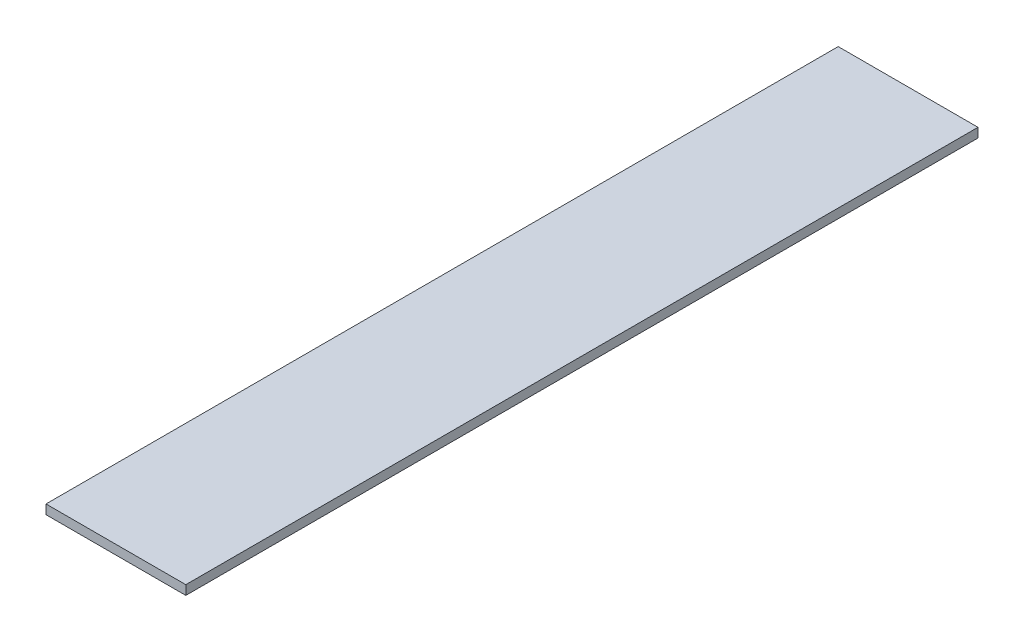
ISO-10303-21;
HEADER;
FILE_DESCRIPTION(('STEP AP214'),'2;1');
FILE_NAME('part.step','',(''),(''),'','','');
FILE_SCHEMA(('AUTOMOTIVE_DESIGN { 1 0 10303 214 1 1 1 1 }'));
ENDSEC;
DATA;
#1=APPLICATION_CONTEXT('core data for automotive mechanical design processes');
#2=APPLICATION_PROTOCOL_DEFINITION('international standard','automotive_design',2000,#1);
#3=PRODUCT_CONTEXT('',#1,'mechanical');
#4=PRODUCT('Part','Part','',(#3));
#5=PRODUCT_RELATED_PRODUCT_CATEGORY('part','',(#4));
#6=PRODUCT_DEFINITION_FORMATION('','',#4);
#7=PRODUCT_DEFINITION_CONTEXT('part definition',#1,'design');
#8=PRODUCT_DEFINITION('design','',#6,#7);
#9=PRODUCT_DEFINITION_SHAPE('','',#8);
#10=(LENGTH_UNIT() NAMED_UNIT(*) SI_UNIT(.MILLI.,.METRE.));
#11=(NAMED_UNIT(*) PLANE_ANGLE_UNIT() SI_UNIT($,.RADIAN.));
#12=(NAMED_UNIT(*) SI_UNIT($,.STERADIAN.) SOLID_ANGLE_UNIT());
#13=UNCERTAINTY_MEASURE_WITH_UNIT(LENGTH_MEASURE(1.E-05),#10,'distance_accuracy_value','');
#14=(GEOMETRIC_REPRESENTATION_CONTEXT(3) GLOBAL_UNCERTAINTY_ASSIGNED_CONTEXT((#13)) GLOBAL_UNIT_ASSIGNED_CONTEXT((#10,
#11,#12)) REPRESENTATION_CONTEXT('',''));
#15=CARTESIAN_POINT('',(0.,0.,0.));
#16=DIRECTION('',(0.,0.,1.));
#17=DIRECTION('',(1.,0.,0.));
#18=AXIS2_PLACEMENT_3D('',#15,#16,#17);
#19=CARTESIAN_POINT('',(0.,1.,0.));
#20=DIRECTION('',(1.,0.,0.));
#21=DIRECTION('',(0.,0.,-1.));
#22=AXIS2_PLACEMENT_3D('',#19,#20,#21);
#23=PLANE('',#22);
#24=DIRECTION('',(0.,0.,1.));
#25=VECTOR('',#24,1.);
#26=CARTESIAN_POINT('',(0.,0.,0.));
#27=LINE('',#26,#25);
#28=CARTESIAN_POINT('',(0.,0.,-85.));
#29=VERTEX_POINT('',#28);
#30=CARTESIAN_POINT('',(0.,0.,0.));
#31=VERTEX_POINT('',#30);
#32=EDGE_CURVE('E96',#29,#31,#27,.T.);
#33=ORIENTED_EDGE('',*,*,#32,.T.);
#34=DIRECTION('',(0.,-1.,0.));
#35=VECTOR('',#34,1.);
#36=CARTESIAN_POINT('',(0.,1.,0.));
#37=LINE('',#36,#35);
#38=CARTESIAN_POINT('',(0.,1.,0.));
#39=VERTEX_POINT('',#38);
#40=EDGE_CURVE('E11',#39,#31,#37,.T.);
#41=ORIENTED_EDGE('',*,*,#40,.F.);
#42=DIRECTION('',(0.,0.,1.));
#43=VECTOR('',#42,1.);
#44=CARTESIAN_POINT('',(0.,1.,0.));
#45=LINE('',#44,#43);
#46=CARTESIAN_POINT('',(0.,1.,-85.));
#47=VERTEX_POINT('',#46);
#48=EDGE_CURVE('E84',#47,#39,#45,.T.);
#49=ORIENTED_EDGE('',*,*,#48,.F.);
#50=DIRECTION('',(0.,-1.,0.));
#51=VECTOR('',#50,1.);
#52=CARTESIAN_POINT('',(0.,1.,-85.));
#53=LINE('',#52,#51);
#54=EDGE_CURVE('E92',#47,#29,#53,.T.);
#55=ORIENTED_EDGE('',*,*,#54,.T.);
#56=EDGE_LOOP('',(#33,#41,#49,#55));
#57=FACE_BOUND('',#56,.T.);
#58=ADVANCED_FACE('F33',(#57),#23,.F.);
#59=CARTESIAN_POINT('',(0.,1.,0.));
#60=DIRECTION('',(0.,0.,-1.));
#61=DIRECTION('',(-1.,0.,0.));
#62=AXIS2_PLACEMENT_3D('',#59,#60,#61);
#63=PLANE('',#62);
#64=DIRECTION('',(1.,0.,0.));
#65=VECTOR('',#64,1.);
#66=CARTESIAN_POINT('',(0.,0.,0.));
#67=LINE('',#66,#65);
#68=CARTESIAN_POINT('',(15.,0.,0.));
#69=VERTEX_POINT('',#68);
#70=EDGE_CURVE('E88',#31,#69,#67,.T.);
#71=ORIENTED_EDGE('',*,*,#70,.T.);
#72=DIRECTION('',(0.,-1.,0.));
#73=VECTOR('',#72,1.);
#74=CARTESIAN_POINT('',(15.,1.,0.));
#75=LINE('',#74,#73);
#76=CARTESIAN_POINT('',(15.,1.,0.));
#77=VERTEX_POINT('',#76);
#78=EDGE_CURVE('E41',#77,#69,#75,.T.);
#79=ORIENTED_EDGE('',*,*,#78,.F.);
#80=DIRECTION('',(1.,0.,0.));
#81=VECTOR('',#80,1.);
#82=CARTESIAN_POINT('',(0.,1.,0.));
#83=LINE('',#82,#81);
#84=EDGE_CURVE('E79',#39,#77,#83,.T.);
#85=ORIENTED_EDGE('',*,*,#84,.F.);
#86=ORIENTED_EDGE('',*,*,#40,.T.);
#87=EDGE_LOOP('',(#71,#79,#85,#86));
#88=FACE_BOUND('',#87,.T.);
#89=ADVANCED_FACE('F87',(#88),#63,.F.);
#90=CARTESIAN_POINT('',(15.,1.,0.));
#91=DIRECTION('',(-1.,0.,0.));
#92=DIRECTION('',(0.,0.,1.));
#93=AXIS2_PLACEMENT_3D('',#90,#91,#92);
#94=PLANE('',#93);
#95=DIRECTION('',(0.,0.,-1.));
#96=VECTOR('',#95,1.);
#97=CARTESIAN_POINT('',(15.,0.,0.));
#98=LINE('',#97,#96);
#99=CARTESIAN_POINT('',(15.,0.,-85.));
#100=VERTEX_POINT('',#99);
#101=EDGE_CURVE('E66',#69,#100,#98,.T.);
#102=ORIENTED_EDGE('',*,*,#101,.T.);
#103=DIRECTION('',(0.,-1.,0.));
#104=VECTOR('',#103,1.);
#105=CARTESIAN_POINT('',(15.,1.,-85.));
#106=LINE('',#105,#104);
#107=CARTESIAN_POINT('',(15.,1.,-85.));
#108=VERTEX_POINT('',#107);
#109=EDGE_CURVE('E89',#108,#100,#106,.T.);
#110=ORIENTED_EDGE('',*,*,#109,.F.);
#111=DIRECTION('',(0.,0.,-1.));
#112=VECTOR('',#111,1.);
#113=CARTESIAN_POINT('',(15.,1.,0.));
#114=LINE('',#113,#112);
#115=EDGE_CURVE('E82',#77,#108,#114,.T.);
#116=ORIENTED_EDGE('',*,*,#115,.F.);
#117=ORIENTED_EDGE('',*,*,#78,.T.);
#118=EDGE_LOOP('',(#102,#110,#116,#117));
#119=FACE_BOUND('',#118,.T.);
#120=ADVANCED_FACE('F90',(#119),#94,.F.);
#121=CARTESIAN_POINT('',(0.,1.,-85.));
#122=DIRECTION('',(0.,0.,1.));
#123=DIRECTION('',(1.,0.,0.));
#124=AXIS2_PLACEMENT_3D('',#121,#122,#123);
#125=PLANE('',#124);
#126=DIRECTION('',(-1.,0.,0.));
#127=VECTOR('',#126,1.);
#128=CARTESIAN_POINT('',(0.,0.,-85.));
#129=LINE('',#128,#127);
#130=EDGE_CURVE('E72',#100,#29,#129,.T.);
#131=ORIENTED_EDGE('',*,*,#130,.T.);
#132=ORIENTED_EDGE('',*,*,#54,.F.);
#133=DIRECTION('',(-1.,0.,0.));
#134=VECTOR('',#133,1.);
#135=CARTESIAN_POINT('',(0.,1.,-85.));
#136=LINE('',#135,#134);
#137=EDGE_CURVE('E49',#108,#47,#136,.T.);
#138=ORIENTED_EDGE('',*,*,#137,.F.);
#139=ORIENTED_EDGE('',*,*,#109,.T.);
#140=EDGE_LOOP('',(#131,#132,#138,#139));
#141=FACE_BOUND('',#140,.T.);
#142=ADVANCED_FACE('F103',(#141),#125,.F.);
#143=CARTESIAN_POINT('',(0.,1.,0.));
#144=DIRECTION('',(0.,-1.,0.));
#145=DIRECTION('',(0.,0.,-1.));
#146=AXIS2_PLACEMENT_3D('',#143,#144,#145);
#147=PLANE('',#146);
#148=ORIENTED_EDGE('',*,*,#48,.T.);
#149=ORIENTED_EDGE('',*,*,#84,.T.);
#150=ORIENTED_EDGE('',*,*,#115,.T.);
#151=ORIENTED_EDGE('',*,*,#137,.T.);
#152=EDGE_LOOP('',(#148,#149,#150,#151));
#153=FACE_BOUND('',#152,.T.);
#154=ADVANCED_FACE('F80',(#153),#147,.F.);
#155=CARTESIAN_POINT('',(0.,0.,0.));
#156=DIRECTION('',(0.,-1.,0.));
#157=DIRECTION('',(0.,0.,-1.));
#158=AXIS2_PLACEMENT_3D('',#155,#156,#157);
#159=PLANE('',#158);
#160=ORIENTED_EDGE('',*,*,#32,.F.);
#161=ORIENTED_EDGE('',*,*,#130,.F.);
#162=ORIENTED_EDGE('',*,*,#101,.F.);
#163=ORIENTED_EDGE('',*,*,#70,.F.);
#164=EDGE_LOOP('',(#160,#161,#162,#163));
#165=FACE_BOUND('',#164,.T.);
#166=ADVANCED_FACE('F106',(#165),#159,.T.);
#167=CLOSED_SHELL('',(#58,#89,#120,#142,#154,#166));
#168=MANIFOLD_SOLID_BREP('B2',#167);
#169=ADVANCED_BREP_SHAPE_REPRESENTATION('',(#18,#168),#14);
#170=SHAPE_DEFINITION_REPRESENTATION(#9,#169);
ENDSEC;
END-ISO-10303-21;
